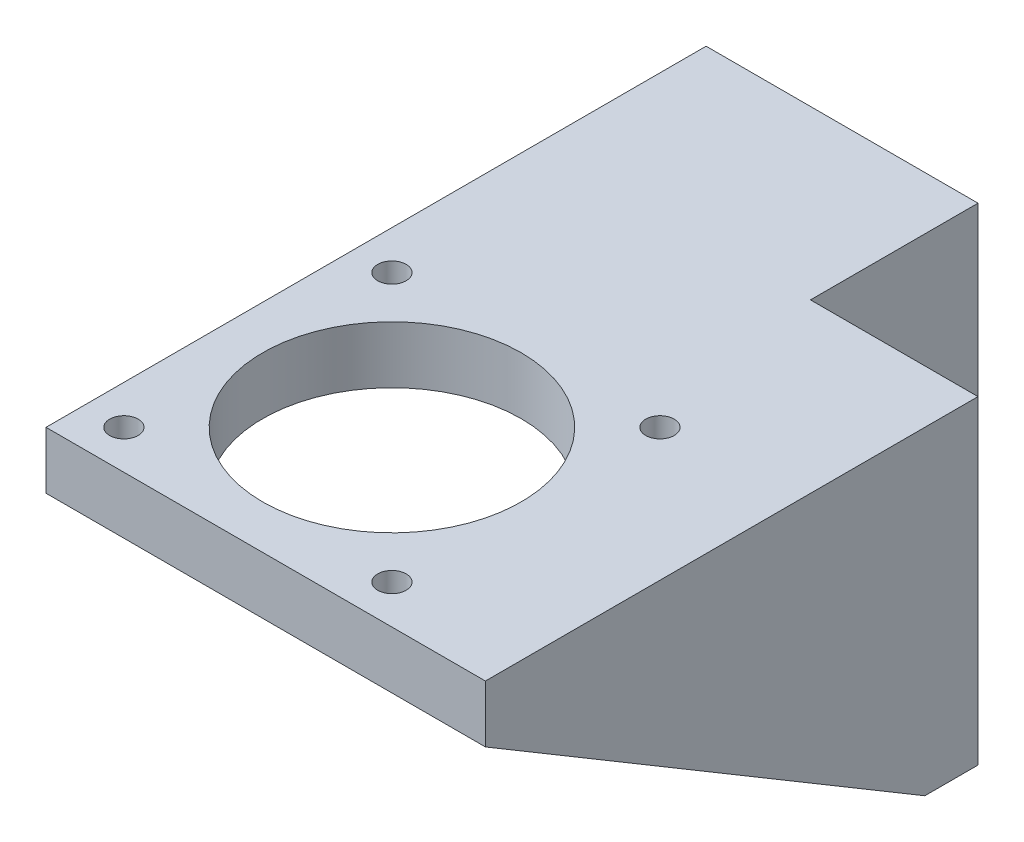
ISO-10303-21;
HEADER;
FILE_DESCRIPTION(('STEP AP214'),'2;1');
FILE_NAME('part.step','',(''),(''),'','','');
FILE_SCHEMA(('AUTOMOTIVE_DESIGN { 1 0 10303 214 1 1 1 1 }'));
ENDSEC;
DATA;
#1=APPLICATION_CONTEXT('core data for automotive mechanical design processes');
#2=APPLICATION_PROTOCOL_DEFINITION('international standard','automotive_design',2000,#1);
#3=PRODUCT_CONTEXT('',#1,'mechanical');
#4=PRODUCT('Part','Part','',(#3));
#5=PRODUCT_RELATED_PRODUCT_CATEGORY('part','',(#4));
#6=PRODUCT_DEFINITION_FORMATION('','',#4);
#7=PRODUCT_DEFINITION_CONTEXT('part definition',#1,'design');
#8=PRODUCT_DEFINITION('design','',#6,#7);
#9=PRODUCT_DEFINITION_SHAPE('','',#8);
#10=(LENGTH_UNIT() NAMED_UNIT(*) SI_UNIT(.MILLI.,.METRE.));
#11=(NAMED_UNIT(*) PLANE_ANGLE_UNIT() SI_UNIT($,.RADIAN.));
#12=(NAMED_UNIT(*) SI_UNIT($,.STERADIAN.) SOLID_ANGLE_UNIT());
#13=UNCERTAINTY_MEASURE_WITH_UNIT(LENGTH_MEASURE(1.E-05),#10,'distance_accuracy_value','');
#14=(GEOMETRIC_REPRESENTATION_CONTEXT(3) GLOBAL_UNCERTAINTY_ASSIGNED_CONTEXT((#13)) GLOBAL_UNIT_ASSIGNED_CONTEXT((#10,
#11,#12)) REPRESENTATION_CONTEXT('',''));
#15=CARTESIAN_POINT('',(0.,0.,0.));
#16=DIRECTION('',(0.,0.,1.));
#17=DIRECTION('',(1.,0.,0.));
#18=AXIS2_PLACEMENT_3D('',#15,#16,#17);
#19=CARTESIAN_POINT('',(-6.35,38.1,0.));
#20=DIRECTION('',(1.,0.,0.));
#21=DIRECTION('',(0.,0.,-1.));
#22=AXIS2_PLACEMENT_3D('',#19,#20,#21);
#23=PLANE('',#22);
#24=CARTESIAN_POINT('',(-6.35,7.82025245742885,-10.));
#25=DIRECTION('',(-1.,0.,0.));
#26=DIRECTION('',(0.,0.,1.));
#27=AXIS2_PLACEMENT_3D('',#24,#25,#26);
#28=CIRCLE('',#27,2.24999999999999);
#29=CARTESIAN_POINT('',(-6.35,7.82025245742885,-7.75000000000001));
#30=VERTEX_POINT('',#29);
#31=EDGE_CURVE('E242',#30,#30,#28,.T.);
#32=ORIENTED_EDGE('',*,*,#31,.F.);
#33=EDGE_LOOP('',(#32));
#34=FACE_BOUND('',#33,.T.);
#35=DIRECTION('',(0.,1.,0.));
#36=VECTOR('',#35,1.);
#37=CARTESIAN_POINT('',(-6.34999999999902,-0.468990170284594,3.81));
#38=LINE('',#37,#36);
#39=CARTESIAN_POINT('',(-6.34999999999902,0.,3.81));
#40=VERTEX_POINT('',#39);
#41=CARTESIAN_POINT('',(-6.34999999999902,31.2810098297154,3.81));
#42=VERTEX_POINT('',#41);
#43=EDGE_CURVE('E150',#40,#42,#38,.T.);
#44=ORIENTED_EDGE('',*,*,#43,.T.);
#45=DIRECTION('',(0.,0.,-1.));
#46=VECTOR('',#45,1.);
#47=CARTESIAN_POINT('',(-6.35,31.2810098297153,0.));
#48=LINE('',#47,#46);
#49=CARTESIAN_POINT('',(-6.35,31.2810098297153,-17.46));
#50=VERTEX_POINT('',#49);
#51=EDGE_CURVE('E69',#42,#50,#48,.T.);
#52=ORIENTED_EDGE('',*,*,#51,.T.);
#53=DIRECTION('',(0.,-1.,0.));
#54=VECTOR('',#53,1.);
#55=CARTESIAN_POINT('',(-6.35,31.2810098297153,-17.46));
#56=LINE('',#55,#54);
#57=CARTESIAN_POINT('',(-6.35,0.,-17.46));
#58=VERTEX_POINT('',#57);
#59=EDGE_CURVE('E64',#50,#58,#56,.T.);
#60=ORIENTED_EDGE('',*,*,#59,.T.);
#61=DIRECTION('',(0.,0.,1.));
#62=VECTOR('',#61,1.);
#63=CARTESIAN_POINT('',(-6.35,0.,0.));
#64=LINE('',#63,#62);
#65=EDGE_CURVE('E159',#58,#40,#64,.T.);
#66=ORIENTED_EDGE('',*,*,#65,.T.);
#67=EDGE_LOOP('',(#44,#52,#60,#66));
#68=FACE_BOUND('',#67,.T.);
#69=CARTESIAN_POINT('',(-6.35,23.4607573722865,-10.));
#70=DIRECTION('',(-1.,0.,0.));
#71=DIRECTION('',(0.,0.,1.));
#72=AXIS2_PLACEMENT_3D('',#69,#70,#71);
#73=CIRCLE('',#72,2.24999999999999);
#74=CARTESIAN_POINT('',(-6.35,23.4607573722865,-7.75000000000001));
#75=VERTEX_POINT('',#74);
#76=EDGE_CURVE('E243',#75,#75,#73,.T.);
#77=ORIENTED_EDGE('',*,*,#76,.F.);
#78=EDGE_LOOP('',(#77));
#79=FACE_BOUND('',#78,.T.);
#80=ADVANCED_FACE('F47',(#34,#68,#79),#23,.F.);
#81=CARTESIAN_POINT('',(9.44070879832782E-13,31.2810098297153,127.584200000004));
#82=DIRECTION('',(0.,1.,0.));
#83=DIRECTION('',(0.,0.,1.));
#84=AXIS2_PLACEMENT_3D('',#81,#82,#83);
#85=PLANE('',#84);
#86=DIRECTION('',(-1.,0.,0.));
#87=VECTOR('',#86,1.);
#88=CARTESIAN_POINT('',(-6.34999999999902,31.2810098297154,3.81));
#89=LINE('',#88,#87);
#90=CARTESIAN_POINT('',(-32.459999999999,31.2810098297154,3.81));
#91=VERTEX_POINT('',#90);
#92=EDGE_CURVE('E147',#42,#91,#89,.T.);
#93=ORIENTED_EDGE('',*,*,#92,.T.);
#94=DIRECTION('',(0.,0.,-1.));
#95=VECTOR('',#94,1.);
#96=CARTESIAN_POINT('',(-32.46,31.2810098297153,0.));
#97=LINE('',#96,#95);
#98=CARTESIAN_POINT('',(-32.46,31.2810098297153,-17.46));
#99=VERTEX_POINT('',#98);
#100=EDGE_CURVE('E165',#91,#99,#97,.T.);
#101=ORIENTED_EDGE('',*,*,#100,.T.);
#102=DIRECTION('',(1.,0.,0.));
#103=VECTOR('',#102,1.);
#104=CARTESIAN_POINT('',(-32.46,31.2810098297153,-17.46));
#105=LINE('',#104,#103);
#106=EDGE_CURVE('E164',#99,#50,#105,.T.);
#107=ORIENTED_EDGE('',*,*,#106,.T.);
#108=ORIENTED_EDGE('',*,*,#51,.F.);
#109=EDGE_LOOP('',(#93,#101,#107,#108));
#110=FACE_BOUND('',#109,.T.);
#111=ADVANCED_FACE('F162',(#110),#85,.F.);
#112=CARTESIAN_POINT('',(0.,38.1,6.35));
#113=DIRECTION('',(0.,0.,-1.));
#114=DIRECTION('',(-1.,0.,0.));
#115=AXIS2_PLACEMENT_3D('',#112,#113,#114);
#116=PLANE('',#115);
#117=CARTESIAN_POINT('',(10.,7.82025245742883,6.35));
#118=DIRECTION('',(0.,0.,1.));
#119=DIRECTION('',(1.,0.,0.));
#120=AXIS2_PLACEMENT_3D('',#117,#118,#119);
#121=CIRCLE('',#120,2.24999999999999);
#122=CARTESIAN_POINT('',(12.25,7.82025245742883,6.35));
#123=VERTEX_POINT('',#122);
#124=EDGE_CURVE('E689',#123,#123,#121,.T.);
#125=ORIENTED_EDGE('',*,*,#124,.F.);
#126=EDGE_LOOP('',(#125));
#127=FACE_BOUND('',#126,.T.);
#128=CARTESIAN_POINT('',(10.,23.4607573722865,6.35));
#129=DIRECTION('',(0.,0.,1.));
#130=DIRECTION('',(1.,0.,0.));
#131=AXIS2_PLACEMENT_3D('',#128,#129,#130);
#132=CIRCLE('',#131,2.24999999999999);
#133=CARTESIAN_POINT('',(12.25,23.4607573722865,6.35));
#134=VERTEX_POINT('',#133);
#135=EDGE_CURVE('E255',#134,#134,#132,.T.);
#136=ORIENTED_EDGE('',*,*,#135,.F.);
#137=EDGE_LOOP('',(#136));
#138=FACE_BOUND('',#137,.T.);
#139=DIRECTION('',(1.,0.,0.));
#140=VECTOR('',#139,1.);
#141=CARTESIAN_POINT('',(0.,0.,6.35));
#142=LINE('',#141,#140);
#143=CARTESIAN_POINT('',(-6.34999999999902,0.,6.35));
#144=VERTEX_POINT('',#143);
#145=CARTESIAN_POINT('',(17.46,0.,6.35));
#146=VERTEX_POINT('',#145);
#147=EDGE_CURVE('E216',#144,#146,#142,.T.);
#148=ORIENTED_EDGE('',*,*,#147,.T.);
#149=DIRECTION('',(0.,1.,0.));
#150=VECTOR('',#149,1.);
#151=CARTESIAN_POINT('',(17.46,0.,6.35));
#152=LINE('',#151,#150);
#153=CARTESIAN_POINT('',(17.46,31.2810098297153,6.35));
#154=VERTEX_POINT('',#153);
#155=EDGE_CURVE('E292',#146,#154,#152,.T.);
#156=ORIENTED_EDGE('',*,*,#155,.T.);
#157=DIRECTION('',(-1.,0.,0.));
#158=VECTOR('',#157,1.);
#159=CARTESIAN_POINT('',(0.,31.2810098297153,6.35));
#160=LINE('',#159,#158);
#161=CARTESIAN_POINT('',(-32.459999999999,31.2810098297154,6.35));
#162=VERTEX_POINT('',#161);
#163=EDGE_CURVE('E166',#154,#162,#160,.T.);
#164=ORIENTED_EDGE('',*,*,#163,.T.);
#165=DIRECTION('',(0.635169905397873,-0.772372443369685,0.));
#166=VECTOR('',#165,1.);
#167=CARTESIAN_POINT('',(-6.34999999999902,-0.468990170284594,6.35));
#168=LINE('',#167,#166);
#169=CARTESIAN_POINT('',(-6.34999999999902,-0.468990170284594,6.35));
#170=VERTEX_POINT('',#169);
#171=EDGE_CURVE('E160',#162,#170,#168,.T.);
#172=ORIENTED_EDGE('',*,*,#171,.T.);
#173=DIRECTION('',(0.,1.,0.));
#174=VECTOR('',#173,1.);
#175=CARTESIAN_POINT('',(-6.34999999999902,-0.468990170284594,6.35));
#176=LINE('',#175,#174);
#177=EDGE_CURVE('E260',#170,#144,#176,.T.);
#178=ORIENTED_EDGE('',*,*,#177,.T.);
#179=EDGE_LOOP('',(#148,#156,#164,#172,#178));
#180=FACE_BOUND('',#179,.T.);
#181=ADVANCED_FACE('F324',(#127,#138,#180),#116,.F.);
#182=CARTESIAN_POINT('',(20.,38.1,0.));
#183=DIRECTION('',(1.,0.,0.));
#184=DIRECTION('',(0.,0.,-1.));
#185=AXIS2_PLACEMENT_3D('',#182,#183,#184);
#186=PLANE('',#185);
#187=DIRECTION('',(0.,-0.512146427110148,-0.858898152983408));
#188=VECTOR('',#187,1.);
#189=CARTESIAN_POINT('',(20.,31.2810098297153,58.81));
#190=LINE('',#189,#188);
#191=CARTESIAN_POINT('',(20.,31.2810098297153,58.81));
#192=VERTEX_POINT('',#191);
#193=CARTESIAN_POINT('',(20.,0.,6.35));
#194=VERTEX_POINT('',#193);
#195=EDGE_CURVE('E286',#192,#194,#190,.T.);
#196=ORIENTED_EDGE('',*,*,#195,.T.);
#197=DIRECTION('',(0.,0.,1.));
#198=VECTOR('',#197,1.);
#199=CARTESIAN_POINT('',(20.,0.,0.));
#200=LINE('',#199,#198);
#201=CARTESIAN_POINT('',(20.,0.,0.));
#202=VERTEX_POINT('',#201);
#203=EDGE_CURVE('E177',#202,#194,#200,.T.);
#204=ORIENTED_EDGE('',*,*,#203,.F.);
#205=DIRECTION('',(0.,-1.,0.));
#206=VECTOR('',#205,1.);
#207=CARTESIAN_POINT('',(20.,38.1,0.));
#208=LINE('',#207,#206);
#209=CARTESIAN_POINT('',(20.,38.1,0.));
#210=VERTEX_POINT('',#209);
#211=EDGE_CURVE('E13',#210,#202,#208,.T.);
#212=ORIENTED_EDGE('',*,*,#211,.F.);
#213=DIRECTION('',(0.,0.,1.));
#214=VECTOR('',#213,1.);
#215=CARTESIAN_POINT('',(20.,38.1,0.));
#216=LINE('',#215,#214);
#217=CARTESIAN_POINT('',(20.,38.1,58.81));
#218=VERTEX_POINT('',#217);
#219=EDGE_CURVE('E213',#210,#218,#216,.T.);
#220=ORIENTED_EDGE('',*,*,#219,.T.);
#221=DIRECTION('',(0.,1.,0.));
#222=VECTOR('',#221,1.);
#223=CARTESIAN_POINT('',(20.,-63.3924695612947,58.81));
#224=LINE('',#223,#222);
#225=EDGE_CURVE('E202',#192,#218,#224,.T.);
#226=ORIENTED_EDGE('',*,*,#225,.F.);
#227=EDGE_LOOP('',(#196,#204,#212,#220,#226));
#228=FACE_BOUND('',#227,.T.);
#229=ADVANCED_FACE('F49',(#228),#186,.T.);
#230=CARTESIAN_POINT('',(0.,38.1,0.));
#231=DIRECTION('',(0.,0.,-1.));
#232=DIRECTION('',(-1.,0.,0.));
#233=AXIS2_PLACEMENT_3D('',#230,#231,#232);
#234=PLANE('',#233);
#235=CARTESIAN_POINT('',(10.,7.82025245742883,0.));
#236=DIRECTION('',(0.,0.,-1.));
#237=DIRECTION('',(-1.,0.,0.));
#238=AXIS2_PLACEMENT_3D('',#235,#236,#237);
#239=CIRCLE('',#238,2.24999999999999);
#240=CARTESIAN_POINT('',(7.75000000000001,7.82025245742883,0.));
#241=VERTEX_POINT('',#240);
#242=EDGE_CURVE('E51',#241,#241,#239,.T.);
#243=ORIENTED_EDGE('',*,*,#242,.F.);
#244=EDGE_LOOP('',(#243));
#245=FACE_BOUND('',#244,.T.);
#246=CARTESIAN_POINT('',(10.,23.4607573722865,0.));
#247=DIRECTION('',(0.,0.,-1.));
#248=DIRECTION('',(-1.,0.,0.));
#249=AXIS2_PLACEMENT_3D('',#246,#247,#248);
#250=CIRCLE('',#249,2.24999999999999);
#251=CARTESIAN_POINT('',(7.75000000000001,23.4607573722865,0.));
#252=VERTEX_POINT('',#251);
#253=EDGE_CURVE('E250',#252,#252,#250,.T.);
#254=ORIENTED_EDGE('',*,*,#253,.F.);
#255=EDGE_LOOP('',(#254));
#256=FACE_BOUND('',#255,.T.);
#257=DIRECTION('',(1.,0.,0.));
#258=VECTOR('',#257,1.);
#259=CARTESIAN_POINT('',(0.,0.,0.));
#260=LINE('',#259,#258);
#261=CARTESIAN_POINT('',(0.,0.,0.));
#262=VERTEX_POINT('',#261);
#263=EDGE_CURVE('E226',#262,#202,#260,.T.);
#264=ORIENTED_EDGE('',*,*,#263,.F.);
#265=DIRECTION('',(0.,-1.,0.));
#266=VECTOR('',#265,1.);
#267=CARTESIAN_POINT('',(0.,38.1,0.));
#268=LINE('',#267,#266);
#269=CARTESIAN_POINT('',(0.,38.1,0.));
#270=VERTEX_POINT('',#269);
#271=EDGE_CURVE('E56',#270,#262,#268,.T.);
#272=ORIENTED_EDGE('',*,*,#271,.F.);
#273=DIRECTION('',(1.,0.,0.));
#274=VECTOR('',#273,1.);
#275=CARTESIAN_POINT('',(0.,38.1,0.));
#276=LINE('',#275,#274);
#277=EDGE_CURVE('E215',#270,#210,#276,.T.);
#278=ORIENTED_EDGE('',*,*,#277,.T.);
#279=ORIENTED_EDGE('',*,*,#211,.T.);
#280=EDGE_LOOP('',(#264,#272,#278,#279));
#281=FACE_BOUND('',#280,.T.);
#282=ADVANCED_FACE('F378',(#245,#256,#281),#234,.T.);
#283=CARTESIAN_POINT('',(0.,38.1,0.));
#284=DIRECTION('',(-1.,0.,0.));
#285=DIRECTION('',(0.,0.,1.));
#286=AXIS2_PLACEMENT_3D('',#283,#284,#285);
#287=PLANE('',#286);
#288=CARTESIAN_POINT('',(0.,23.4607573722865,-10.));
#289=DIRECTION('',(-1.,0.,0.));
#290=DIRECTION('',(0.,0.,1.));
#291=AXIS2_PLACEMENT_3D('',#288,#289,#290);
#292=CIRCLE('',#291,2.24999999999999);
#293=CARTESIAN_POINT('',(0.,23.4607573722865,-7.75000000000001));
#294=VERTEX_POINT('',#293);
#295=EDGE_CURVE('E240',#294,#294,#292,.T.);
#296=ORIENTED_EDGE('',*,*,#295,.T.);
#297=EDGE_LOOP('',(#296));
#298=FACE_BOUND('',#297,.T.);
#299=CARTESIAN_POINT('',(0.,7.82025245742885,-10.));
#300=DIRECTION('',(-1.,0.,0.));
#301=DIRECTION('',(0.,0.,1.));
#302=AXIS2_PLACEMENT_3D('',#299,#300,#301);
#303=CIRCLE('',#302,2.24999999999999);
#304=CARTESIAN_POINT('',(0.,7.82025245742885,-7.75000000000001));
#305=VERTEX_POINT('',#304);
#306=EDGE_CURVE('E247',#305,#305,#303,.T.);
#307=ORIENTED_EDGE('',*,*,#306,.T.);
#308=EDGE_LOOP('',(#307));
#309=FACE_BOUND('',#308,.T.);
#310=DIRECTION('',(0.,0.,-1.));
#311=VECTOR('',#310,1.);
#312=CARTESIAN_POINT('',(0.,0.,0.));
#313=LINE('',#312,#311);
#314=CARTESIAN_POINT('',(0.,0.,-20.));
#315=VERTEX_POINT('',#314);
#316=EDGE_CURVE('E229',#262,#315,#313,.T.);
#317=ORIENTED_EDGE('',*,*,#316,.T.);
#318=DIRECTION('',(0.,-1.,0.));
#319=VECTOR('',#318,1.);
#320=CARTESIAN_POINT('',(0.,38.1,-20.));
#321=LINE('',#320,#319);
#322=CARTESIAN_POINT('',(0.,38.1,-20.));
#323=VERTEX_POINT('',#322);
#324=EDGE_CURVE('E223',#323,#315,#321,.T.);
#325=ORIENTED_EDGE('',*,*,#324,.F.);
#326=DIRECTION('',(0.,0.,-1.));
#327=VECTOR('',#326,1.);
#328=CARTESIAN_POINT('',(0.,38.1,0.));
#329=LINE('',#328,#327);
#330=EDGE_CURVE('E219',#270,#323,#329,.T.);
#331=ORIENTED_EDGE('',*,*,#330,.F.);
#332=ORIENTED_EDGE('',*,*,#271,.T.);
#333=EDGE_LOOP('',(#317,#325,#331,#332));
#334=FACE_BOUND('',#333,.T.);
#335=ADVANCED_FACE('F376',(#298,#309,#334),#287,.F.);
#336=CARTESIAN_POINT('',(0.,38.1,-20.));
#337=DIRECTION('',(0.,0.,1.));
#338=DIRECTION('',(1.,0.,0.));
#339=AXIS2_PLACEMENT_3D('',#336,#337,#338);
#340=PLANE('',#339);
#341=DIRECTION('',(-1.,0.,0.));
#342=VECTOR('',#341,1.);
#343=CARTESIAN_POINT('',(0.,0.,-20.));
#344=LINE('',#343,#342);
#345=CARTESIAN_POINT('',(-6.35,0.,-20.));
#346=VERTEX_POINT('',#345);
#347=EDGE_CURVE('E231',#315,#346,#344,.T.);
#348=ORIENTED_EDGE('',*,*,#347,.T.);
#349=DIRECTION('',(-0.640799644926337,0.767708157480615,0.));
#350=VECTOR('',#349,1.);
#351=CARTESIAN_POINT('',(-6.35,0.,-20.));
#352=LINE('',#351,#350);
#353=CARTESIAN_POINT('',(-32.46,31.2810098297153,-20.));
#354=VERTEX_POINT('',#353);
#355=EDGE_CURVE('E275',#346,#354,#352,.T.);
#356=ORIENTED_EDGE('',*,*,#355,.T.);
#357=DIRECTION('',(0.,1.,0.));
#358=VECTOR('',#357,1.);
#359=CARTESIAN_POINT('',(-32.46,-63.3924695612947,-20.));
#360=LINE('',#359,#358);
#361=CARTESIAN_POINT('',(-32.46,38.1,-20.));
#362=VERTEX_POINT('',#361);
#363=EDGE_CURVE('E201',#354,#362,#360,.T.);
#364=ORIENTED_EDGE('',*,*,#363,.T.);
#365=DIRECTION('',(-1.,0.,0.));
#366=VECTOR('',#365,1.);
#367=CARTESIAN_POINT('',(0.,38.1,-20.));
#368=LINE('',#367,#366);
#369=EDGE_CURVE('E221',#323,#362,#368,.T.);
#370=ORIENTED_EDGE('',*,*,#369,.F.);
#371=ORIENTED_EDGE('',*,*,#324,.T.);
#372=EDGE_LOOP('',(#348,#356,#364,#370,#371));
#373=FACE_BOUND('',#372,.T.);
#374=ADVANCED_FACE('F373',(#373),#340,.F.);
#375=CARTESIAN_POINT('',(0.,38.1,0.));
#376=DIRECTION('',(0.,1.,0.));
#377=DIRECTION('',(0.,0.,1.));
#378=AXIS2_PLACEMENT_3D('',#375,#376,#377);
#379=PLANE('',#378);
#380=DIRECTION('',(-1.,0.,0.));
#381=VECTOR('',#380,1.);
#382=CARTESIAN_POINT('',(0.,38.1,58.81));
#383=LINE('',#382,#381);
#384=CARTESIAN_POINT('',(-32.46,38.1,58.81));
#385=VERTEX_POINT('',#384);
#386=EDGE_CURVE('E192',#218,#385,#383,.T.);
#387=ORIENTED_EDGE('',*,*,#386,.F.);
#388=ORIENTED_EDGE('',*,*,#219,.F.);
#389=ORIENTED_EDGE('',*,*,#277,.F.);
#390=ORIENTED_EDGE('',*,*,#330,.T.);
#391=ORIENTED_EDGE('',*,*,#369,.T.);
#392=DIRECTION('',(0.,0.,1.));
#393=VECTOR('',#392,1.);
#394=CARTESIAN_POINT('',(-32.46,38.1,0.));
#395=LINE('',#394,#393);
#396=EDGE_CURVE('E189',#362,#385,#395,.T.);
#397=ORIENTED_EDGE('',*,*,#396,.T.);
#398=EDGE_LOOP('',(#387,#388,#389,#390,#391,#397));
#399=FACE_BOUND('',#398,.T.);
#400=CARTESIAN_POINT('',(4.19000000000094,38.1,22.1599999999991));
#401=DIRECTION('',(0.,1.,0.));
#402=DIRECTION('',(0.,0.,1.));
#403=AXIS2_PLACEMENT_3D('',#400,#401,#402);
#404=CIRCLE('',#403,1.69999999999999);
#405=CARTESIAN_POINT('',(4.19000000000094,38.1,23.8599999999991));
#406=VERTEX_POINT('',#405);
#407=EDGE_CURVE('E179',#406,#406,#404,.T.);
#408=ORIENTED_EDGE('',*,*,#407,.F.);
#409=EDGE_LOOP('',(#408));
#410=FACE_BOUND('',#409,.T.);
#411=CARTESIAN_POINT('',(-11.81,38.1,38.16));
#412=DIRECTION('',(0.,1.,0.));
#413=DIRECTION('',(0.,0.,1.));
#414=AXIS2_PLACEMENT_3D('',#411,#412,#413);
#415=CIRCLE('',#414,15.4319934283718);
#416=CARTESIAN_POINT('',(-11.81,38.1,53.5919934283719));
#417=VERTEX_POINT('',#416);
#418=EDGE_CURVE('E182',#417,#417,#415,.T.);
#419=ORIENTED_EDGE('',*,*,#418,.F.);
#420=EDGE_LOOP('',(#419));
#421=FACE_BOUND('',#420,.T.);
#422=CARTESIAN_POINT('',(-27.8100000000009,38.1,22.1599999999991));
#423=DIRECTION('',(0.,1.,0.));
#424=DIRECTION('',(0.,0.,1.));
#425=AXIS2_PLACEMENT_3D('',#422,#423,#424);
#426=CIRCLE('',#425,1.69999999999999);
#427=CARTESIAN_POINT('',(-27.8100000000009,38.1,23.8599999999991));
#428=VERTEX_POINT('',#427);
#429=EDGE_CURVE('E186',#428,#428,#426,.T.);
#430=ORIENTED_EDGE('',*,*,#429,.F.);
#431=EDGE_LOOP('',(#430));
#432=FACE_BOUND('',#431,.T.);
#433=CARTESIAN_POINT('',(-27.8100000000009,38.1,54.1600000000009));
#434=DIRECTION('',(0.,1.,0.));
#435=DIRECTION('',(0.,0.,1.));
#436=AXIS2_PLACEMENT_3D('',#433,#434,#435);
#437=CIRCLE('',#436,1.69999999999999);
#438=CARTESIAN_POINT('',(-27.8100000000009,38.1,55.8600000000009));
#439=VERTEX_POINT('',#438);
#440=EDGE_CURVE('E195',#439,#439,#437,.T.);
#441=ORIENTED_EDGE('',*,*,#440,.F.);
#442=EDGE_LOOP('',(#441));
#443=FACE_BOUND('',#442,.T.);
#444=CARTESIAN_POINT('',(4.19000000000094,38.1,54.1600000000009));
#445=DIRECTION('',(0.,1.,0.));
#446=DIRECTION('',(0.,0.,1.));
#447=AXIS2_PLACEMENT_3D('',#444,#445,#446);
#448=CIRCLE('',#447,1.69999999999999);
#449=CARTESIAN_POINT('',(4.19000000000094,38.1,55.8600000000009));
#450=VERTEX_POINT('',#449);
#451=EDGE_CURVE('E198',#450,#450,#448,.T.);
#452=ORIENTED_EDGE('',*,*,#451,.F.);
#453=EDGE_LOOP('',(#452));
#454=FACE_BOUND('',#453,.T.);
#455=ADVANCED_FACE('F337',(#399,#410,#421,#432,#443,#454),#379,.T.);
#456=CARTESIAN_POINT('',(0.,0.,0.));
#457=DIRECTION('',(0.,1.,0.));
#458=DIRECTION('',(0.,0.,1.));
#459=AXIS2_PLACEMENT_3D('',#456,#457,#458);
#460=PLANE('',#459);
#461=ORIENTED_EDGE('',*,*,#203,.T.);
#462=DIRECTION('',(1.,0.,0.));
#463=VECTOR('',#462,1.);
#464=CARTESIAN_POINT('',(17.46,0.,6.35));
#465=LINE('',#464,#463);
#466=EDGE_CURVE('E183',#146,#194,#465,.T.);
#467=ORIENTED_EDGE('',*,*,#466,.F.);
#468=ORIENTED_EDGE('',*,*,#147,.F.);
#469=DIRECTION('',(0.,0.,-1.));
#470=VECTOR('',#469,1.);
#471=CARTESIAN_POINT('',(-6.34999999999902,0.,0.));
#472=LINE('',#471,#470);
#473=EDGE_CURVE('E270',#144,#40,#472,.T.);
#474=ORIENTED_EDGE('',*,*,#473,.T.);
#475=ORIENTED_EDGE('',*,*,#65,.F.);
#476=EDGE_CURVE('E233',#346,#58,#64,.T.);
#477=ORIENTED_EDGE('',*,*,#476,.F.);
#478=ORIENTED_EDGE('',*,*,#347,.F.);
#479=ORIENTED_EDGE('',*,*,#316,.F.);
#480=ORIENTED_EDGE('',*,*,#263,.T.);
#481=EDGE_LOOP('',(#461,#467,#468,#474,#475,#477,#478,#479,#480));
#482=FACE_BOUND('',#481,.T.);
#483=ADVANCED_FACE('F329',(#482),#460,.F.);
#484=CARTESIAN_POINT('',(-27.8100000000009,-63.3924695612947,54.1600000000009));
#485=DIRECTION('',(0.,1.,0.));
#486=DIRECTION('',(0.,0.,1.));
#487=AXIS2_PLACEMENT_3D('',#484,#485,#486);
#488=CYLINDRICAL_SURFACE('',#487,1.69999999999999);
#489=CARTESIAN_POINT('',(-27.8100000000009,31.2810098297153,54.1600000000009));
#490=DIRECTION('',(0.,1.,0.));
#491=DIRECTION('',(0.,0.,1.));
#492=AXIS2_PLACEMENT_3D('',#489,#490,#491);
#493=CIRCLE('',#492,1.69999999999999);
#494=CARTESIAN_POINT('',(-27.8100000000009,31.2810098297153,55.8600000000009));
#495=VERTEX_POINT('',#494);
#496=EDGE_CURVE('E174',#495,#495,#493,.F.);
#497=ORIENTED_EDGE('',*,*,#496,.T.);
#498=EDGE_LOOP('',(#497));
#499=FACE_BOUND('',#498,.T.);
#500=ORIENTED_EDGE('',*,*,#440,.T.);
#501=EDGE_LOOP('',(#500));
#502=FACE_BOUND('',#501,.T.);
#503=ADVANCED_FACE('F417',(#499,#502),#488,.F.);
#504=CARTESIAN_POINT('',(-32.46,-63.3924695612947,0.));
#505=DIRECTION('',(-1.,0.,0.));
#506=DIRECTION('',(0.,0.,1.));
#507=AXIS2_PLACEMENT_3D('',#504,#505,#506);
#508=PLANE('',#507);
#509=CARTESIAN_POINT('',(-32.46,31.2810098297153,58.81));
#510=VERTEX_POINT('',#509);
#511=EDGE_CURVE('E168',#510,#162,#97,.T.);
#512=ORIENTED_EDGE('',*,*,#511,.F.);
#513=DIRECTION('',(0.,1.,0.));
#514=VECTOR('',#513,1.);
#515=CARTESIAN_POINT('',(-32.46,-63.3924695612947,58.81));
#516=LINE('',#515,#514);
#517=EDGE_CURVE('E205',#510,#385,#516,.T.);
#518=ORIENTED_EDGE('',*,*,#517,.T.);
#519=ORIENTED_EDGE('',*,*,#396,.F.);
#520=ORIENTED_EDGE('',*,*,#363,.F.);
#521=DIRECTION('',(0.,0.,-1.));
#522=VECTOR('',#521,1.);
#523=CARTESIAN_POINT('',(-32.46,31.2810098297153,-17.46));
#524=LINE('',#523,#522);
#525=EDGE_CURVE('E281',#99,#354,#524,.T.);
#526=ORIENTED_EDGE('',*,*,#525,.F.);
#527=ORIENTED_EDGE('',*,*,#100,.F.);
#528=DIRECTION('',(0.,0.,1.));
#529=VECTOR('',#528,1.);
#530=CARTESIAN_POINT('',(-32.459999999999,31.2810098297154,3.81));
#531=LINE('',#530,#529);
#532=EDGE_CURVE('E263',#91,#162,#531,.T.);
#533=ORIENTED_EDGE('',*,*,#532,.T.);
#534=EDGE_LOOP('',(#512,#518,#519,#520,#526,#527,#533));
#535=FACE_BOUND('',#534,.T.);
#536=ADVANCED_FACE('F343',(#535),#508,.T.);
#537=CARTESIAN_POINT('',(0.,-63.3924695612947,58.81));
#538=DIRECTION('',(0.,0.,-1.));
#539=DIRECTION('',(-1.,0.,0.));
#540=AXIS2_PLACEMENT_3D('',#537,#538,#539);
#541=PLANE('',#540);
#542=ORIENTED_EDGE('',*,*,#517,.F.);
#543=DIRECTION('',(1.,0.,0.));
#544=VECTOR('',#543,1.);
#545=CARTESIAN_POINT('',(0.,31.2810098297153,58.81));
#546=LINE('',#545,#544);
#547=CARTESIAN_POINT('',(17.46,31.2810098297153,58.81));
#548=VERTEX_POINT('',#547);
#549=EDGE_CURVE('E170',#510,#548,#546,.T.);
#550=ORIENTED_EDGE('',*,*,#549,.T.);
#551=DIRECTION('',(1.,0.,0.));
#552=VECTOR('',#551,1.);
#553=CARTESIAN_POINT('',(17.46,31.2810098297153,58.81));
#554=LINE('',#553,#552);
#555=EDGE_CURVE('E295',#548,#192,#554,.T.);
#556=ORIENTED_EDGE('',*,*,#555,.T.);
#557=ORIENTED_EDGE('',*,*,#225,.T.);
#558=ORIENTED_EDGE('',*,*,#386,.T.);
#559=EDGE_LOOP('',(#542,#550,#556,#557,#558));
#560=FACE_BOUND('',#559,.T.);
#561=ADVANCED_FACE('F311',(#560),#541,.F.);
#562=CARTESIAN_POINT('',(-27.8100000000009,-63.3924695612947,22.1599999999991));
#563=DIRECTION('',(0.,1.,0.));
#564=DIRECTION('',(0.,0.,1.));
#565=AXIS2_PLACEMENT_3D('',#562,#563,#564);
#566=CYLINDRICAL_SURFACE('',#565,1.69999999999999);
#567=CARTESIAN_POINT('',(-27.8100000000009,31.2810098297153,22.1599999999991));
#568=DIRECTION('',(0.,1.,0.));
#569=DIRECTION('',(0.,0.,1.));
#570=AXIS2_PLACEMENT_3D('',#567,#568,#569);
#571=CIRCLE('',#570,1.69999999999999);
#572=CARTESIAN_POINT('',(-27.8100000000009,31.2810098297153,23.8599999999991));
#573=VERTEX_POINT('',#572);
#574=EDGE_CURVE('E303',#573,#573,#571,.F.);
#575=ORIENTED_EDGE('',*,*,#574,.T.);
#576=EDGE_LOOP('',(#575));
#577=FACE_BOUND('',#576,.T.);
#578=ORIENTED_EDGE('',*,*,#429,.T.);
#579=EDGE_LOOP('',(#578));
#580=FACE_BOUND('',#579,.T.);
#581=ADVANCED_FACE('F423',(#577,#580),#566,.F.);
#582=CARTESIAN_POINT('',(-11.81,-63.3924695612947,38.16));
#583=DIRECTION('',(0.,1.,0.));
#584=DIRECTION('',(0.,0.,1.));
#585=AXIS2_PLACEMENT_3D('',#582,#583,#584);
#586=CYLINDRICAL_SURFACE('',#585,15.4319934283718);
#587=CARTESIAN_POINT('',(-11.81,31.2810098297153,38.16));
#588=DIRECTION('',(0.,1.,0.));
#589=DIRECTION('',(0.,0.,1.));
#590=AXIS2_PLACEMENT_3D('',#587,#588,#589);
#591=CIRCLE('',#590,15.4319934283718);
#592=CARTESIAN_POINT('',(-11.81,31.2810098297153,53.5919934283719));
#593=VERTEX_POINT('',#592);
#594=EDGE_CURVE('E178',#593,#593,#591,.F.);
#595=ORIENTED_EDGE('',*,*,#594,.T.);
#596=EDGE_LOOP('',(#595));
#597=FACE_BOUND('',#596,.T.);
#598=ORIENTED_EDGE('',*,*,#418,.T.);
#599=EDGE_LOOP('',(#598));
#600=FACE_BOUND('',#599,.T.);
#601=ADVANCED_FACE('F428',(#597,#600),#586,.F.);
#602=CARTESIAN_POINT('',(4.19000000000094,-63.3924695612947,22.1599999999991));
#603=DIRECTION('',(0.,1.,0.));
#604=DIRECTION('',(0.,0.,1.));
#605=AXIS2_PLACEMENT_3D('',#602,#603,#604);
#606=CYLINDRICAL_SURFACE('',#605,1.69999999999999);
#607=CARTESIAN_POINT('',(4.19000000000094,31.2810098297153,22.1599999999991));
#608=DIRECTION('',(0.,1.,0.));
#609=DIRECTION('',(0.,0.,1.));
#610=AXIS2_PLACEMENT_3D('',#607,#608,#609);
#611=CIRCLE('',#610,1.69999999999999);
#612=CARTESIAN_POINT('',(4.19000000000094,31.2810098297153,23.8599999999991));
#613=VERTEX_POINT('',#612);
#614=EDGE_CURVE('E212',#613,#613,#611,.F.);
#615=ORIENTED_EDGE('',*,*,#614,.T.);
#616=EDGE_LOOP('',(#615));
#617=FACE_BOUND('',#616,.T.);
#618=ORIENTED_EDGE('',*,*,#407,.T.);
#619=EDGE_LOOP('',(#618));
#620=FACE_BOUND('',#619,.T.);
#621=ADVANCED_FACE('F415',(#617,#620),#606,.F.);
#622=CARTESIAN_POINT('',(4.19000000000094,-63.3924695612947,54.1600000000009));
#623=DIRECTION('',(0.,1.,0.));
#624=DIRECTION('',(0.,0.,1.));
#625=AXIS2_PLACEMENT_3D('',#622,#623,#624);
#626=CYLINDRICAL_SURFACE('',#625,1.69999999999999);
#627=CARTESIAN_POINT('',(4.19000000000094,31.2810098297153,54.1600000000009));
#628=DIRECTION('',(0.,1.,0.));
#629=DIRECTION('',(0.,0.,1.));
#630=AXIS2_PLACEMENT_3D('',#627,#628,#629);
#631=CIRCLE('',#630,1.69999999999999);
#632=CARTESIAN_POINT('',(4.19000000000094,31.2810098297153,55.8600000000009));
#633=VERTEX_POINT('',#632);
#634=EDGE_CURVE('E209',#633,#633,#631,.F.);
#635=ORIENTED_EDGE('',*,*,#634,.T.);
#636=EDGE_LOOP('',(#635));
#637=FACE_BOUND('',#636,.T.);
#638=ORIENTED_EDGE('',*,*,#451,.T.);
#639=EDGE_LOOP('',(#638));
#640=FACE_BOUND('',#639,.T.);
#641=ADVANCED_FACE('F411',(#637,#640),#626,.F.);
#642=ORIENTED_EDGE('',*,*,#574,.F.);
#643=EDGE_LOOP('',(#642));
#644=FACE_BOUND('',#643,.T.);
#645=ORIENTED_EDGE('',*,*,#614,.F.);
#646=EDGE_LOOP('',(#645));
#647=FACE_BOUND('',#646,.T.);
#648=ORIENTED_EDGE('',*,*,#634,.F.);
#649=EDGE_LOOP('',(#648));
#650=FACE_BOUND('',#649,.T.);
#651=ORIENTED_EDGE('',*,*,#594,.F.);
#652=EDGE_LOOP('',(#651));
#653=FACE_BOUND('',#652,.T.);
#654=ORIENTED_EDGE('',*,*,#511,.T.);
#655=ORIENTED_EDGE('',*,*,#163,.F.);
#656=DIRECTION('',(0.,0.,1.));
#657=VECTOR('',#656,1.);
#658=CARTESIAN_POINT('',(17.46,31.2810098297153,6.35));
#659=LINE('',#658,#657);
#660=EDGE_CURVE('E287',#154,#548,#659,.T.);
#661=ORIENTED_EDGE('',*,*,#660,.T.);
#662=ORIENTED_EDGE('',*,*,#549,.F.);
#663=EDGE_LOOP('',(#654,#655,#661,#662));
#664=FACE_BOUND('',#663,.T.);
#665=ORIENTED_EDGE('',*,*,#496,.F.);
#666=EDGE_LOOP('',(#665));
#667=FACE_BOUND('',#666,.T.);
#668=ADVANCED_FACE('F315',(#644,#647,#650,#653,#664,#667),#85,.F.);
#669=CARTESIAN_POINT('',(17.46,31.2810098297153,58.81));
#670=DIRECTION('',(0.,-0.858898152983408,0.512146427110148));
#671=DIRECTION('',(0.,-0.512146427110148,-0.858898152983408));
#672=AXIS2_PLACEMENT_3D('',#669,#670,#671);
#673=PLANE('',#672);
#674=ORIENTED_EDGE('',*,*,#195,.F.);
#675=ORIENTED_EDGE('',*,*,#555,.F.);
#676=DIRECTION('',(0.,-0.512146427110148,-0.858898152983408));
#677=VECTOR('',#676,1.);
#678=CARTESIAN_POINT('',(17.46,31.2810098297153,58.81));
#679=LINE('',#678,#677);
#680=EDGE_CURVE('E290',#548,#146,#679,.T.);
#681=ORIENTED_EDGE('',*,*,#680,.T.);
#682=ORIENTED_EDGE('',*,*,#466,.T.);
#683=EDGE_LOOP('',(#674,#675,#681,#682));
#684=FACE_BOUND('',#683,.T.);
#685=ADVANCED_FACE('F332',(#684),#673,.T.);
#686=CARTESIAN_POINT('',(17.46,0.,0.));
#687=DIRECTION('',(-1.,0.,0.));
#688=DIRECTION('',(0.,0.,1.));
#689=AXIS2_PLACEMENT_3D('',#686,#687,#688);
#690=PLANE('',#689);
#691=ORIENTED_EDGE('',*,*,#660,.F.);
#692=ORIENTED_EDGE('',*,*,#155,.F.);
#693=ORIENTED_EDGE('',*,*,#680,.F.);
#694=EDGE_LOOP('',(#691,#692,#693));
#695=FACE_BOUND('',#694,.T.);
#696=ADVANCED_FACE('F321',(#695),#690,.T.);
#697=CARTESIAN_POINT('',(-6.35,0.,-17.46));
#698=DIRECTION('',(-0.767708157480615,-0.640799644926337,0.));
#699=DIRECTION('',(0.640799644926337,-0.767708157480615,0.));
#700=AXIS2_PLACEMENT_3D('',#697,#698,#699);
#701=PLANE('',#700);
#702=ORIENTED_EDGE('',*,*,#355,.F.);
#703=ORIENTED_EDGE('',*,*,#476,.T.);
#704=DIRECTION('',(-0.640799644926337,0.767708157480615,0.));
#705=VECTOR('',#704,1.);
#706=CARTESIAN_POINT('',(-6.35,0.,-17.46));
#707=LINE('',#706,#705);
#708=EDGE_CURVE('E277',#58,#99,#707,.T.);
#709=ORIENTED_EDGE('',*,*,#708,.T.);
#710=ORIENTED_EDGE('',*,*,#525,.T.);
#711=EDGE_LOOP('',(#702,#703,#709,#710));
#712=FACE_BOUND('',#711,.T.);
#713=ADVANCED_FACE('F357',(#712),#701,.T.);
#714=CARTESIAN_POINT('',(0.,0.,-17.46));
#715=DIRECTION('',(0.,0.,1.));
#716=DIRECTION('',(1.,0.,0.));
#717=AXIS2_PLACEMENT_3D('',#714,#715,#716);
#718=PLANE('',#717);
#719=ORIENTED_EDGE('',*,*,#59,.F.);
#720=ORIENTED_EDGE('',*,*,#106,.F.);
#721=ORIENTED_EDGE('',*,*,#708,.F.);
#722=EDGE_LOOP('',(#719,#720,#721));
#723=FACE_BOUND('',#722,.T.);
#724=ADVANCED_FACE('F350',(#723),#718,.T.);
#725=CARTESIAN_POINT('',(-6.34999999999902,-0.468990170284594,3.81));
#726=DIRECTION('',(1.,0.,0.));
#727=DIRECTION('',(0.,0.,-1.));
#728=AXIS2_PLACEMENT_3D('',#725,#726,#727);
#729=PLANE('',#728);
#730=ORIENTED_EDGE('',*,*,#473,.F.);
#731=ORIENTED_EDGE('',*,*,#177,.F.);
#732=DIRECTION('',(0.,0.,1.));
#733=VECTOR('',#732,1.);
#734=CARTESIAN_POINT('',(-6.34999999999902,-0.468990170284594,3.81));
#735=LINE('',#734,#733);
#736=CARTESIAN_POINT('',(-6.34999999999902,-0.468990170284594,3.81));
#737=VERTEX_POINT('',#736);
#738=EDGE_CURVE('E268',#737,#170,#735,.T.);
#739=ORIENTED_EDGE('',*,*,#738,.F.);
#740=EDGE_CURVE('E156',#737,#40,#38,.T.);
#741=ORIENTED_EDGE('',*,*,#740,.T.);
#742=EDGE_LOOP('',(#730,#731,#739,#741));
#743=FACE_BOUND('',#742,.T.);
#744=ADVANCED_FACE('F348',(#743),#729,.T.);
#745=CARTESIAN_POINT('',(-6.34999999999902,-0.468990170284594,3.81));
#746=DIRECTION('',(-0.772372443369685,-0.635169905397873,0.));
#747=DIRECTION('',(0.635169905397873,-0.772372443369685,0.));
#748=AXIS2_PLACEMENT_3D('',#745,#746,#747);
#749=PLANE('',#748);
#750=ORIENTED_EDGE('',*,*,#171,.F.);
#751=ORIENTED_EDGE('',*,*,#532,.F.);
#752=DIRECTION('',(0.635169905397873,-0.772372443369685,0.));
#753=VECTOR('',#752,1.);
#754=CARTESIAN_POINT('',(-6.34999999999902,-0.468990170284594,3.81));
#755=LINE('',#754,#753);
#756=EDGE_CURVE('E153',#91,#737,#755,.T.);
#757=ORIENTED_EDGE('',*,*,#756,.T.);
#758=ORIENTED_EDGE('',*,*,#738,.T.);
#759=EDGE_LOOP('',(#750,#751,#757,#758));
#760=FACE_BOUND('',#759,.T.);
#761=ADVANCED_FACE('F346',(#760),#749,.T.);
#762=CARTESIAN_POINT('',(0.,0.,3.81));
#763=DIRECTION('',(0.,0.,1.));
#764=DIRECTION('',(1.,0.,0.));
#765=AXIS2_PLACEMENT_3D('',#762,#763,#764);
#766=PLANE('',#765);
#767=ORIENTED_EDGE('',*,*,#740,.F.);
#768=ORIENTED_EDGE('',*,*,#756,.F.);
#769=ORIENTED_EDGE('',*,*,#92,.F.);
#770=ORIENTED_EDGE('',*,*,#43,.F.);
#771=EDGE_LOOP('',(#767,#768,#769,#770));
#772=FACE_BOUND('',#771,.T.);
#773=ADVANCED_FACE('F149',(#772),#766,.F.);
#774=CARTESIAN_POINT('',(-6.35,7.82025245742885,-10.));
#775=DIRECTION('',(-1.,0.,0.));
#776=DIRECTION('',(0.,0.,1.));
#777=AXIS2_PLACEMENT_3D('',#774,#775,#776);
#778=CYLINDRICAL_SURFACE('',#777,2.24999999999999);
#779=ORIENTED_EDGE('',*,*,#31,.T.);
#780=EDGE_LOOP('',(#779));
#781=FACE_BOUND('',#780,.T.);
#782=ORIENTED_EDGE('',*,*,#306,.F.);
#783=EDGE_LOOP('',(#782));
#784=FACE_BOUND('',#783,.T.);
#785=ADVANCED_FACE('F468',(#781,#784),#778,.F.);
#786=CARTESIAN_POINT('',(-6.35,23.4607573722865,-10.));
#787=DIRECTION('',(-1.,0.,0.));
#788=DIRECTION('',(0.,0.,1.));
#789=AXIS2_PLACEMENT_3D('',#786,#787,#788);
#790=CYLINDRICAL_SURFACE('',#789,2.24999999999999);
#791=ORIENTED_EDGE('',*,*,#76,.T.);
#792=EDGE_LOOP('',(#791));
#793=FACE_BOUND('',#792,.T.);
#794=ORIENTED_EDGE('',*,*,#295,.F.);
#795=EDGE_LOOP('',(#794));
#796=FACE_BOUND('',#795,.T.);
#797=ADVANCED_FACE('F478',(#793,#796),#790,.F.);
#798=CARTESIAN_POINT('',(10.,23.4607573722865,6.35));
#799=DIRECTION('',(0.,0.,1.));
#800=DIRECTION('',(1.,0.,0.));
#801=AXIS2_PLACEMENT_3D('',#798,#799,#800);
#802=CYLINDRICAL_SURFACE('',#801,2.24999999999999);
#803=ORIENTED_EDGE('',*,*,#253,.T.);
#804=EDGE_LOOP('',(#803));
#805=FACE_BOUND('',#804,.T.);
#806=ORIENTED_EDGE('',*,*,#135,.T.);
#807=EDGE_LOOP('',(#806));
#808=FACE_BOUND('',#807,.T.);
#809=ADVANCED_FACE('F486',(#805,#808),#802,.F.);
#810=CARTESIAN_POINT('',(10.,7.82025245742883,6.35));
#811=DIRECTION('',(0.,0.,1.));
#812=DIRECTION('',(1.,0.,0.));
#813=AXIS2_PLACEMENT_3D('',#810,#811,#812);
#814=CYLINDRICAL_SURFACE('',#813,2.24999999999999);
#815=ORIENTED_EDGE('',*,*,#242,.T.);
#816=EDGE_LOOP('',(#815));
#817=FACE_BOUND('',#816,.T.);
#818=ORIENTED_EDGE('',*,*,#124,.T.);
#819=EDGE_LOOP('',(#818));
#820=FACE_BOUND('',#819,.T.);
#821=ADVANCED_FACE('F492',(#817,#820),#814,.F.);
#822=CLOSED_SHELL('',(#80,#111,#181,#229,#282,#335,#374,#455,#483,#503,#536,#561,#581,#601,#621,
#641,#668,#685,#696,#713,#724,#744,#761,#773,#785,#797,#809,#821));
#823=MANIFOLD_SOLID_BREP('B2',#822);
#824=ADVANCED_BREP_SHAPE_REPRESENTATION('',(#18,#823),#14);
#825=SHAPE_DEFINITION_REPRESENTATION(#9,#824);
ENDSEC;
END-ISO-10303-21;
